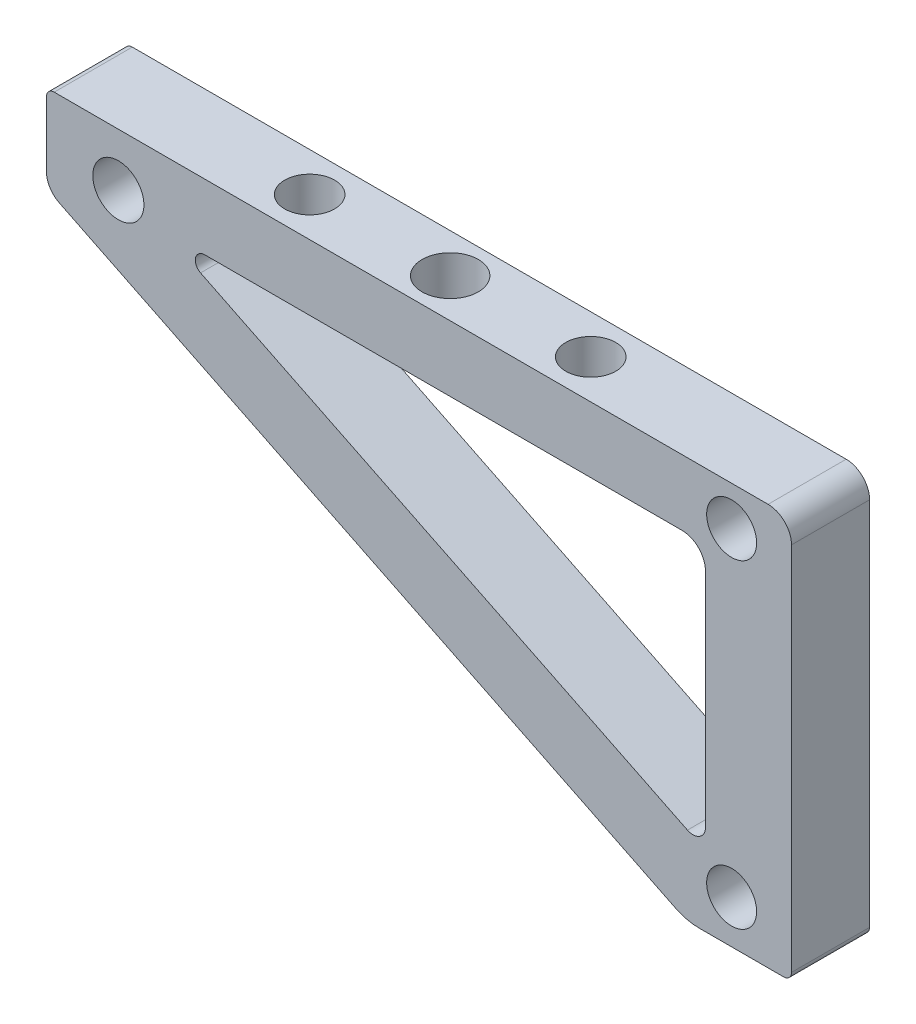
ISO-10303-21;
HEADER;
FILE_DESCRIPTION(('STEP AP214'),'2;1');
FILE_NAME('part.step','',(''),(''),'','','');
FILE_SCHEMA(('AUTOMOTIVE_DESIGN { 1 0 10303 214 1 1 1 1 }'));
ENDSEC;
DATA;
#1=APPLICATION_CONTEXT('core data for automotive mechanical design processes');
#2=APPLICATION_PROTOCOL_DEFINITION('international standard','automotive_design',2000,#1);
#3=PRODUCT_CONTEXT('',#1,'mechanical');
#4=PRODUCT('Part','Part','',(#3));
#5=PRODUCT_RELATED_PRODUCT_CATEGORY('part','',(#4));
#6=PRODUCT_DEFINITION_FORMATION('','',#4);
#7=PRODUCT_DEFINITION_CONTEXT('part definition',#1,'design');
#8=PRODUCT_DEFINITION('design','',#6,#7);
#9=PRODUCT_DEFINITION_SHAPE('','',#8);
#10=(LENGTH_UNIT() NAMED_UNIT(*) SI_UNIT(.MILLI.,.METRE.));
#11=(NAMED_UNIT(*) PLANE_ANGLE_UNIT() SI_UNIT($,.RADIAN.));
#12=(NAMED_UNIT(*) SI_UNIT($,.STERADIAN.) SOLID_ANGLE_UNIT());
#13=UNCERTAINTY_MEASURE_WITH_UNIT(LENGTH_MEASURE(1.E-05),#10,'distance_accuracy_value','');
#14=(GEOMETRIC_REPRESENTATION_CONTEXT(3) GLOBAL_UNCERTAINTY_ASSIGNED_CONTEXT((#13)) GLOBAL_UNIT_ASSIGNED_CONTEXT((#10,
#11,#12)) REPRESENTATION_CONTEXT('',''));
#15=CARTESIAN_POINT('',(0.,0.,0.));
#16=DIRECTION('',(0.,0.,1.));
#17=DIRECTION('',(1.,0.,0.));
#18=AXIS2_PLACEMENT_3D('',#15,#16,#17);
#19=CARTESIAN_POINT('',(13.3710113093788,-10.4732911103491,6.35));
#20=DIRECTION('',(0.,0.,1.));
#21=DIRECTION('',(1.,0.,0.));
#22=AXIS2_PLACEMENT_3D('',#19,#20,#21);
#23=PLANE('',#22);
#24=CARTESIAN_POINT('',(-33.8838438970048,13.4336716952027,6.35));
#25=DIRECTION('',(0.,0.,-1.));
#26=DIRECTION('',(-1.,0.,0.));
#27=AXIS2_PLACEMENT_3D('',#24,#25,#26);
#28=CIRCLE('',#27,2.07896372310807);
#29=CARTESIAN_POINT('',(-35.9628076201128,13.4336716952027,6.35));
#30=VERTEX_POINT('',#29);
#31=EDGE_CURVE('E552',#30,#30,#28,.T.);
#32=ORIENTED_EDGE('',*,*,#31,.T.);
#33=EDGE_LOOP('',(#32));
#34=FACE_BOUND('',#33,.T.);
#35=CARTESIAN_POINT('',(15.9873466903869,14.5382384856211,6.35));
#36=DIRECTION('',(0.,0.,-1.));
#37=DIRECTION('',(-1.,0.,0.));
#38=AXIS2_PLACEMENT_3D('',#35,#36,#37);
#39=CIRCLE('',#38,2.032);
#40=CARTESIAN_POINT('',(13.9553466903869,14.5382384856211,6.35));
#41=VERTEX_POINT('',#40);
#42=EDGE_CURVE('E556',#41,#41,#39,.T.);
#43=ORIENTED_EDGE('',*,*,#42,.T.);
#44=EDGE_LOOP('',(#43));
#45=FACE_BOUND('',#44,.T.);
#46=CARTESIAN_POINT('',(15.9873466903869,-11.4190810892118,6.35));
#47=DIRECTION('',(0.,0.,-1.));
#48=DIRECTION('',(-1.,0.,0.));
#49=AXIS2_PLACEMENT_3D('',#46,#47,#48);
#50=CIRCLE('',#49,2.032);
#51=CARTESIAN_POINT('',(13.9553466903869,-11.4190810892118,6.35));
#52=VERTEX_POINT('',#51);
#53=EDGE_CURVE('E566',#52,#52,#50,.T.);
#54=ORIENTED_EDGE('',*,*,#53,.T.);
#55=EDGE_LOOP('',(#54));
#56=FACE_BOUND('',#55,.T.);
#57=CARTESIAN_POINT('',(13.3710113093788,-10.4732911103491,6.35));
#58=DIRECTION('',(0.,0.,1.));
#59=DIRECTION('',(1.,0.,0.));
#60=AXIS2_PLACEMENT_3D('',#57,#58,#59);
#61=CIRCLE('',#60,4.44499999999991);
#62=CARTESIAN_POINT('',(11.4117177924005,-14.4631775641628,6.35));
#63=VERTEX_POINT('',#62);
#64=CARTESIAN_POINT('',(13.3710113093788,-14.918291110349,6.35));
#65=VERTEX_POINT('',#64);
#66=EDGE_CURVE('E210',#63,#65,#61,.T.);
#67=ORIENTED_EDGE('',*,*,#66,.T.);
#68=DIRECTION('',(1.,0.,0.));
#69=VECTOR('',#68,1.);
#70=CARTESIAN_POINT('',(13.3710113093788,-14.918291110349,6.35));
#71=LINE('',#70,#69);
#72=CARTESIAN_POINT('',(20.2217266524743,-14.918291110349,6.35));
#73=VERTEX_POINT('',#72);
#74=EDGE_CURVE('E209',#65,#73,#71,.T.);
#75=ORIENTED_EDGE('',*,*,#74,.T.);
#76=CARTESIAN_POINT('',(20.2217266524743,-14.283291110349,6.35));
#77=DIRECTION('',(0.,0.,1.));
#78=DIRECTION('',(1.,0.,0.));
#79=AXIS2_PLACEMENT_3D('',#76,#77,#78);
#80=CIRCLE('',#79,0.634999999999998);
#81=CARTESIAN_POINT('',(20.8567266524743,-14.283291110349,6.35));
#82=VERTEX_POINT('',#81);
#83=EDGE_CURVE('E213',#73,#82,#80,.T.);
#84=ORIENTED_EDGE('',*,*,#83,.T.);
#85=DIRECTION('',(0.,1.,0.));
#86=VECTOR('',#85,1.);
#87=CARTESIAN_POINT('',(20.8567266524743,15.8273321626688,6.35));
#88=LINE('',#87,#86);
#89=CARTESIAN_POINT('',(20.8567266524743,15.8273321626688,6.35));
#90=VERTEX_POINT('',#89);
#91=EDGE_CURVE('E214',#82,#90,#88,.T.);
#92=ORIENTED_EDGE('',*,*,#91,.T.);
#93=CARTESIAN_POINT('',(18.9517266524743,15.8273321626688,6.35));
#94=DIRECTION('',(0.,0.,1.));
#95=DIRECTION('',(1.,0.,0.));
#96=AXIS2_PLACEMENT_3D('',#93,#94,#95);
#97=CIRCLE('',#96,1.905);
#98=CARTESIAN_POINT('',(18.9517266524743,17.7323321626688,6.35));
#99=VERTEX_POINT('',#98);
#100=EDGE_CURVE('E220',#90,#99,#97,.T.);
#101=ORIENTED_EDGE('',*,*,#100,.T.);
#102=DIRECTION('',(-1.,0.,0.));
#103=VECTOR('',#102,1.);
#104=CARTESIAN_POINT('',(18.9517266524743,17.7323321626688,6.35));
#105=LINE('',#104,#103);
#106=CARTESIAN_POINT('',(-39.0992604233761,17.7323321626689,6.35));
#107=VERTEX_POINT('',#106);
#108=EDGE_CURVE('E218',#99,#107,#105,.T.);
#109=ORIENTED_EDGE('',*,*,#108,.T.);
#110=CARTESIAN_POINT('',(-39.0992604233761,17.0973321626688,6.35));
#111=DIRECTION('',(0.,0.,1.));
#112=DIRECTION('',(1.,0.,0.));
#113=AXIS2_PLACEMENT_3D('',#110,#111,#112);
#114=CIRCLE('',#113,0.635000000000011);
#115=CARTESIAN_POINT('',(-39.7342604233761,17.0973321626688,6.35));
#116=VERTEX_POINT('',#115);
#117=EDGE_CURVE('E222',#107,#116,#114,.T.);
#118=ORIENTED_EDGE('',*,*,#117,.T.);
#119=DIRECTION('',(0.,-1.,0.));
#120=VECTOR('',#119,1.);
#121=CARTESIAN_POINT('',(-39.7342604233761,17.0973321626688,6.35));
#122=LINE('',#121,#120);
#123=CARTESIAN_POINT('',(-39.7342604233761,11.839639722161,6.35));
#124=VERTEX_POINT('',#123);
#125=EDGE_CURVE('E224',#116,#124,#122,.T.);
#126=ORIENTED_EDGE('',*,*,#125,.T.);
#127=CARTESIAN_POINT('',(-37.8292604233761,11.839639722161,6.35));
#128=DIRECTION('',(0.,0.,1.));
#129=DIRECTION('',(1.,0.,0.));
#130=AXIS2_PLACEMENT_3D('',#127,#128,#129);
#131=CIRCLE('',#130,1.905);
#132=CARTESIAN_POINT('',(-38.6689576449382,10.1296883848123,6.35));
#133=VERTEX_POINT('',#132);
#134=EDGE_CURVE('E223',#124,#133,#131,.T.);
#135=ORIENTED_EDGE('',*,*,#134,.T.);
#136=DIRECTION('',(0.897612250576778,-0.44078594307724,0.));
#137=VECTOR('',#136,1.);
#138=CARTESIAN_POINT('',(-38.6689576449382,10.1296883848123,6.35));
#139=LINE('',#138,#137);
#140=EDGE_CURVE('E230',#133,#63,#139,.T.);
#141=ORIENTED_EDGE('',*,*,#140,.T.);
#142=EDGE_LOOP('',(#67,#75,#84,#92,#101,#109,#118,#126,#135,#141));
#143=FACE_BOUND('',#142,.T.);
#144=DIRECTION('',(0.897612250576778,-0.44078594307724,0.));
#145=VECTOR('',#144,1.);
#146=CARTESIAN_POINT('',(12.3946762268889,-8.49095327423301,6.35));
#147=LINE('',#146,#145);
#148=CARTESIAN_POINT('',(-27.199482674509,10.9523516277314,6.35));
#149=VERTEX_POINT('',#148);
#150=CARTESIAN_POINT('',(12.3946762268889,-8.49095327423301,6.35));
#151=VERTEX_POINT('',#150);
#152=EDGE_CURVE('E165',#149,#151,#147,.T.);
#153=ORIENTED_EDGE('',*,*,#152,.F.);
#154=CARTESIAN_POINT('',(-26.8636037858843,11.6363321626707,6.35));
#155=DIRECTION('',(0.,0.,1.));
#156=DIRECTION('',(-1.,0.,0.));
#157=AXIS2_PLACEMENT_3D('',#154,#155,#156);
#158=CIRCLE('',#157,0.761999999999749);
#159=CARTESIAN_POINT('',(-26.8636037858843,12.3983321626704,6.35));
#160=VERTEX_POINT('',#159);
#161=EDGE_CURVE('E152',#160,#149,#158,.T.);
#162=ORIENTED_EDGE('',*,*,#161,.F.);
#163=DIRECTION('',(-1.,0.,0.));
#164=VECTOR('',#163,1.);
#165=CARTESIAN_POINT('',(11.9535147450558,12.3983321626704,6.35));
#166=LINE('',#165,#164);
#167=CARTESIAN_POINT('',(11.9535147450558,12.3983321626704,6.35));
#168=VERTEX_POINT('',#167);
#169=EDGE_CURVE('E184',#168,#160,#166,.T.);
#170=ORIENTED_EDGE('',*,*,#169,.F.);
#171=CARTESIAN_POINT('',(11.9535147450558,10.4933321626704,6.35));
#172=DIRECTION('',(0.,0.,1.));
#173=DIRECTION('',(-1.,0.,0.));
#174=AXIS2_PLACEMENT_3D('',#171,#172,#173);
#175=CIRCLE('',#174,1.905);
#176=CARTESIAN_POINT('',(13.8585147450558,10.4933321626704,6.35));
#177=VERTEX_POINT('',#176);
#178=EDGE_CURVE('E185',#177,#168,#175,.T.);
#179=ORIENTED_EDGE('',*,*,#178,.F.);
#180=DIRECTION('',(0.,1.,0.));
#181=VECTOR('',#180,1.);
#182=CARTESIAN_POINT('',(13.8585147450558,-7.57897922764673,6.35));
#183=LINE('',#182,#181);
#184=CARTESIAN_POINT('',(13.8585147450557,-7.57897922764681,6.35));
#185=VERTEX_POINT('',#184);
#186=EDGE_CURVE('E180',#185,#177,#183,.T.);
#187=ORIENTED_EDGE('',*,*,#186,.F.);
#188=CARTESIAN_POINT('',(12.8425147450555,-7.57897922764681,6.35));
#189=DIRECTION('',(0.,0.,1.));
#190=DIRECTION('',(1.,0.,0.));
#191=AXIS2_PLACEMENT_3D('',#188,#189,#190);
#192=CIRCLE('',#191,1.01600000000027);
#193=EDGE_CURVE('E171',#151,#185,#192,.T.);
#194=ORIENTED_EDGE('',*,*,#193,.F.);
#195=EDGE_LOOP('',(#153,#162,#170,#179,#187,#194));
#196=FACE_BOUND('',#195,.T.);
#197=ADVANCED_FACE('F39',(#34,#45,#56,#143,#196),#23,.T.);
#198=CARTESIAN_POINT('',(13.3710113093788,-10.4732911103491,0.));
#199=DIRECTION('',(0.,0.,1.));
#200=DIRECTION('',(1.,0.,0.));
#201=AXIS2_PLACEMENT_3D('',#198,#199,#200);
#202=PLANE('',#201);
#203=CARTESIAN_POINT('',(-33.8838438970048,13.4336716952027,0.));
#204=DIRECTION('',(0.,0.,-1.));
#205=DIRECTION('',(-1.,0.,0.));
#206=AXIS2_PLACEMENT_3D('',#203,#204,#205);
#207=CIRCLE('',#206,2.07896372310807);
#208=CARTESIAN_POINT('',(-35.9628076201128,13.4336716952027,0.));
#209=VERTEX_POINT('',#208);
#210=EDGE_CURVE('E551',#209,#209,#207,.T.);
#211=ORIENTED_EDGE('',*,*,#210,.F.);
#212=EDGE_LOOP('',(#211));
#213=FACE_BOUND('',#212,.T.);
#214=CARTESIAN_POINT('',(15.9873466903869,14.5382384856211,0.));
#215=DIRECTION('',(0.,0.,-1.));
#216=DIRECTION('',(-1.,0.,0.));
#217=AXIS2_PLACEMENT_3D('',#214,#215,#216);
#218=CIRCLE('',#217,2.032);
#219=CARTESIAN_POINT('',(13.9553466903869,14.5382384856211,0.));
#220=VERTEX_POINT('',#219);
#221=EDGE_CURVE('E553',#220,#220,#218,.T.);
#222=ORIENTED_EDGE('',*,*,#221,.F.);
#223=EDGE_LOOP('',(#222));
#224=FACE_BOUND('',#223,.T.);
#225=CARTESIAN_POINT('',(15.9873466903869,-11.4190810892118,0.));
#226=DIRECTION('',(0.,0.,-1.));
#227=DIRECTION('',(-1.,0.,0.));
#228=AXIS2_PLACEMENT_3D('',#225,#226,#227);
#229=CIRCLE('',#228,2.032);
#230=CARTESIAN_POINT('',(13.9553466903869,-11.4190810892118,0.));
#231=VERTEX_POINT('',#230);
#232=EDGE_CURVE('E564',#231,#231,#229,.T.);
#233=ORIENTED_EDGE('',*,*,#232,.F.);
#234=EDGE_LOOP('',(#233));
#235=FACE_BOUND('',#234,.T.);
#236=CARTESIAN_POINT('',(13.3710113093788,-10.4732911103491,0.));
#237=DIRECTION('',(0.,0.,1.));
#238=DIRECTION('',(1.,0.,0.));
#239=AXIS2_PLACEMENT_3D('',#236,#237,#238);
#240=CIRCLE('',#239,4.44499999999991);
#241=CARTESIAN_POINT('',(11.4117177924005,-14.4631775641628,0.));
#242=VERTEX_POINT('',#241);
#243=CARTESIAN_POINT('',(13.3710113093788,-14.918291110349,0.));
#244=VERTEX_POINT('',#243);
#245=EDGE_CURVE('E168',#242,#244,#240,.T.);
#246=ORIENTED_EDGE('',*,*,#245,.F.);
#247=DIRECTION('',(0.897612250576778,-0.44078594307724,0.));
#248=VECTOR('',#247,1.);
#249=CARTESIAN_POINT('',(-38.6689576449382,10.1296883848123,0.));
#250=LINE('',#249,#248);
#251=CARTESIAN_POINT('',(-38.6689576449382,10.1296883848123,0.));
#252=VERTEX_POINT('',#251);
#253=EDGE_CURVE('E211',#252,#242,#250,.T.);
#254=ORIENTED_EDGE('',*,*,#253,.F.);
#255=CARTESIAN_POINT('',(-37.8292604233761,11.839639722161,0.));
#256=DIRECTION('',(0.,0.,1.));
#257=DIRECTION('',(1.,0.,0.));
#258=AXIS2_PLACEMENT_3D('',#255,#256,#257);
#259=CIRCLE('',#258,1.905);
#260=CARTESIAN_POINT('',(-39.7342604233761,11.839639722161,0.));
#261=VERTEX_POINT('',#260);
#262=EDGE_CURVE('E246',#261,#252,#259,.T.);
#263=ORIENTED_EDGE('',*,*,#262,.F.);
#264=DIRECTION('',(0.,-1.,0.));
#265=VECTOR('',#264,1.);
#266=CARTESIAN_POINT('',(-39.7342604233761,17.0973321626688,0.));
#267=LINE('',#266,#265);
#268=CARTESIAN_POINT('',(-39.7342604233761,17.0973321626688,0.));
#269=VERTEX_POINT('',#268);
#270=EDGE_CURVE('E244',#269,#261,#267,.T.);
#271=ORIENTED_EDGE('',*,*,#270,.F.);
#272=CARTESIAN_POINT('',(-39.0992604233761,17.0973321626688,0.));
#273=DIRECTION('',(0.,0.,1.));
#274=DIRECTION('',(1.,0.,0.));
#275=AXIS2_PLACEMENT_3D('',#272,#273,#274);
#276=CIRCLE('',#275,0.635000000000011);
#277=CARTESIAN_POINT('',(-39.0992604233761,17.7323321626689,0.));
#278=VERTEX_POINT('',#277);
#279=EDGE_CURVE('E245',#278,#269,#276,.T.);
#280=ORIENTED_EDGE('',*,*,#279,.F.);
#281=DIRECTION('',(-1.,0.,0.));
#282=VECTOR('',#281,1.);
#283=CARTESIAN_POINT('',(18.9517266524743,17.7323321626688,0.));
#284=LINE('',#283,#282);
#285=CARTESIAN_POINT('',(18.9517266524743,17.7323321626688,0.));
#286=VERTEX_POINT('',#285);
#287=EDGE_CURVE('E238',#286,#278,#284,.T.);
#288=ORIENTED_EDGE('',*,*,#287,.F.);
#289=CARTESIAN_POINT('',(18.9517266524743,15.8273321626688,0.));
#290=DIRECTION('',(0.,0.,1.));
#291=DIRECTION('',(1.,0.,0.));
#292=AXIS2_PLACEMENT_3D('',#289,#290,#291);
#293=CIRCLE('',#292,1.905);
#294=CARTESIAN_POINT('',(20.8567266524743,15.8273321626688,0.));
#295=VERTEX_POINT('',#294);
#296=EDGE_CURVE('E236',#295,#286,#293,.T.);
#297=ORIENTED_EDGE('',*,*,#296,.F.);
#298=DIRECTION('',(0.,1.,0.));
#299=VECTOR('',#298,1.);
#300=CARTESIAN_POINT('',(20.8567266524743,15.8273321626688,0.));
#301=LINE('',#300,#299);
#302=CARTESIAN_POINT('',(20.8567266524743,-14.283291110349,0.));
#303=VERTEX_POINT('',#302);
#304=EDGE_CURVE('E237',#303,#295,#301,.T.);
#305=ORIENTED_EDGE('',*,*,#304,.F.);
#306=CARTESIAN_POINT('',(20.2217266524743,-14.283291110349,0.));
#307=DIRECTION('',(0.,0.,1.));
#308=DIRECTION('',(1.,0.,0.));
#309=AXIS2_PLACEMENT_3D('',#306,#307,#308);
#310=CIRCLE('',#309,0.634999999999998);
#311=CARTESIAN_POINT('',(20.2217266524743,-14.918291110349,0.));
#312=VERTEX_POINT('',#311);
#313=EDGE_CURVE('E232',#312,#303,#310,.T.);
#314=ORIENTED_EDGE('',*,*,#313,.F.);
#315=DIRECTION('',(1.,0.,0.));
#316=VECTOR('',#315,1.);
#317=CARTESIAN_POINT('',(13.3710113093788,-14.918291110349,0.));
#318=LINE('',#317,#316);
#319=EDGE_CURVE('E235',#244,#312,#318,.T.);
#320=ORIENTED_EDGE('',*,*,#319,.F.);
#321=EDGE_LOOP('',(#246,#254,#263,#271,#280,#288,#297,#305,#314,#320));
#322=FACE_BOUND('',#321,.T.);
#323=CARTESIAN_POINT('',(-26.8636037858843,11.6363321626707,0.));
#324=DIRECTION('',(0.,0.,1.));
#325=DIRECTION('',(-1.,0.,0.));
#326=AXIS2_PLACEMENT_3D('',#323,#324,#325);
#327=CIRCLE('',#326,0.761999999999749);
#328=CARTESIAN_POINT('',(-26.8636037858843,12.3983321626704,0.));
#329=VERTEX_POINT('',#328);
#330=CARTESIAN_POINT('',(-27.199482674509,10.9523516277314,0.));
#331=VERTEX_POINT('',#330);
#332=EDGE_CURVE('E64',#329,#331,#327,.T.);
#333=ORIENTED_EDGE('',*,*,#332,.T.);
#334=DIRECTION('',(0.897612250576778,-0.44078594307724,0.));
#335=VECTOR('',#334,1.);
#336=CARTESIAN_POINT('',(12.3946762268889,-8.49095327423301,0.));
#337=LINE('',#336,#335);
#338=CARTESIAN_POINT('',(12.3946762268889,-8.49095327423301,0.));
#339=VERTEX_POINT('',#338);
#340=EDGE_CURVE('E166',#331,#339,#337,.T.);
#341=ORIENTED_EDGE('',*,*,#340,.T.);
#342=CARTESIAN_POINT('',(12.8425147450555,-7.57897922764681,0.));
#343=DIRECTION('',(0.,0.,1.));
#344=DIRECTION('',(1.,0.,0.));
#345=AXIS2_PLACEMENT_3D('',#342,#343,#344);
#346=CIRCLE('',#345,1.01600000000027);
#347=CARTESIAN_POINT('',(13.8585147450557,-7.57897922764681,0.));
#348=VERTEX_POINT('',#347);
#349=EDGE_CURVE('E189',#339,#348,#346,.T.);
#350=ORIENTED_EDGE('',*,*,#349,.T.);
#351=DIRECTION('',(0.,1.,0.));
#352=VECTOR('',#351,1.);
#353=CARTESIAN_POINT('',(13.8585147450558,-7.57897922764673,0.));
#354=LINE('',#353,#352);
#355=CARTESIAN_POINT('',(13.8585147450558,10.4933321626704,0.));
#356=VERTEX_POINT('',#355);
#357=EDGE_CURVE('E195',#348,#356,#354,.T.);
#358=ORIENTED_EDGE('',*,*,#357,.T.);
#359=CARTESIAN_POINT('',(11.9535147450558,10.4933321626704,0.));
#360=DIRECTION('',(0.,0.,1.));
#361=DIRECTION('',(-1.,0.,0.));
#362=AXIS2_PLACEMENT_3D('',#359,#360,#361);
#363=CIRCLE('',#362,1.905);
#364=CARTESIAN_POINT('',(11.9535147450558,12.3983321626704,0.));
#365=VERTEX_POINT('',#364);
#366=EDGE_CURVE('E194',#356,#365,#363,.T.);
#367=ORIENTED_EDGE('',*,*,#366,.T.);
#368=DIRECTION('',(-1.,0.,0.));
#369=VECTOR('',#368,1.);
#370=CARTESIAN_POINT('',(11.9535147450558,12.3983321626704,0.));
#371=LINE('',#370,#369);
#372=EDGE_CURVE('E162',#365,#329,#371,.T.);
#373=ORIENTED_EDGE('',*,*,#372,.T.);
#374=EDGE_LOOP('',(#333,#341,#350,#358,#367,#373));
#375=FACE_BOUND('',#374,.T.);
#376=ADVANCED_FACE('F291',(#213,#224,#235,#322,#375),#202,.F.);
#377=CARTESIAN_POINT('',(13.3710113093788,-10.4732911103491,6.35));
#378=DIRECTION('',(0.,0.,-1.));
#379=DIRECTION('',(-1.,0.,0.));
#380=AXIS2_PLACEMENT_3D('',#377,#378,#379);
#381=CYLINDRICAL_SURFACE('',#380,4.44499999999991);
#382=ORIENTED_EDGE('',*,*,#245,.T.);
#383=DIRECTION('',(0.,0.,-1.));
#384=VECTOR('',#383,1.);
#385=CARTESIAN_POINT('',(13.3710113093788,-14.918291110349,6.35));
#386=LINE('',#385,#384);
#387=EDGE_CURVE('E11',#65,#244,#386,.T.);
#388=ORIENTED_EDGE('',*,*,#387,.F.);
#389=ORIENTED_EDGE('',*,*,#66,.F.);
#390=DIRECTION('',(0.,0.,-1.));
#391=VECTOR('',#390,1.);
#392=CARTESIAN_POINT('',(11.4117177924005,-14.4631775641628,6.35));
#393=LINE('',#392,#391);
#394=EDGE_CURVE('E229',#63,#242,#393,.T.);
#395=ORIENTED_EDGE('',*,*,#394,.T.);
#396=EDGE_LOOP('',(#382,#388,#389,#395));
#397=FACE_BOUND('',#396,.T.);
#398=ADVANCED_FACE('F41',(#397),#381,.T.);
#399=CARTESIAN_POINT('',(13.3710113093788,-14.918291110349,6.35));
#400=DIRECTION('',(0.,1.,0.));
#401=DIRECTION('',(0.,0.,1.));
#402=AXIS2_PLACEMENT_3D('',#399,#400,#401);
#403=PLANE('',#402);
#404=ORIENTED_EDGE('',*,*,#319,.T.);
#405=DIRECTION('',(0.,0.,-1.));
#406=VECTOR('',#405,1.);
#407=CARTESIAN_POINT('',(20.2217266524743,-14.918291110349,6.35));
#408=LINE('',#407,#406);
#409=EDGE_CURVE('E48',#73,#312,#408,.T.);
#410=ORIENTED_EDGE('',*,*,#409,.F.);
#411=ORIENTED_EDGE('',*,*,#74,.F.);
#412=ORIENTED_EDGE('',*,*,#387,.T.);
#413=EDGE_LOOP('',(#404,#410,#411,#412));
#414=FACE_BOUND('',#413,.T.);
#415=ADVANCED_FACE('F351',(#414),#403,.F.);
#416=CARTESIAN_POINT('',(20.2217266524743,-14.283291110349,6.35));
#417=DIRECTION('',(0.,0.,-1.));
#418=DIRECTION('',(-1.,0.,0.));
#419=AXIS2_PLACEMENT_3D('',#416,#417,#418);
#420=CYLINDRICAL_SURFACE('',#419,0.634999999999998);
#421=ORIENTED_EDGE('',*,*,#313,.T.);
#422=DIRECTION('',(0.,0.,-1.));
#423=VECTOR('',#422,1.);
#424=CARTESIAN_POINT('',(20.8567266524743,-14.283291110349,6.35));
#425=LINE('',#424,#423);
#426=EDGE_CURVE('E267',#82,#303,#425,.T.);
#427=ORIENTED_EDGE('',*,*,#426,.F.);
#428=ORIENTED_EDGE('',*,*,#83,.F.);
#429=ORIENTED_EDGE('',*,*,#409,.T.);
#430=EDGE_LOOP('',(#421,#427,#428,#429));
#431=FACE_BOUND('',#430,.T.);
#432=ADVANCED_FACE('F355',(#431),#420,.T.);
#433=CARTESIAN_POINT('',(20.8567266524743,15.8273321626688,6.35));
#434=DIRECTION('',(-1.,0.,0.));
#435=DIRECTION('',(0.,-1.,0.));
#436=AXIS2_PLACEMENT_3D('',#433,#434,#435);
#437=PLANE('',#436);
#438=ORIENTED_EDGE('',*,*,#304,.T.);
#439=DIRECTION('',(0.,0.,-1.));
#440=VECTOR('',#439,1.);
#441=CARTESIAN_POINT('',(20.8567266524743,15.8273321626688,6.35));
#442=LINE('',#441,#440);
#443=EDGE_CURVE('E266',#90,#295,#442,.T.);
#444=ORIENTED_EDGE('',*,*,#443,.F.);
#445=ORIENTED_EDGE('',*,*,#91,.F.);
#446=ORIENTED_EDGE('',*,*,#426,.T.);
#447=EDGE_LOOP('',(#438,#444,#445,#446));
#448=FACE_BOUND('',#447,.T.);
#449=ADVANCED_FACE('F346',(#448),#437,.F.);
#450=CARTESIAN_POINT('',(18.9517266524743,15.8273321626688,6.35));
#451=DIRECTION('',(0.,0.,-1.));
#452=DIRECTION('',(-1.,0.,0.));
#453=AXIS2_PLACEMENT_3D('',#450,#451,#452);
#454=CYLINDRICAL_SURFACE('',#453,1.905);
#455=ORIENTED_EDGE('',*,*,#296,.T.);
#456=DIRECTION('',(0.,0.,-1.));
#457=VECTOR('',#456,1.);
#458=CARTESIAN_POINT('',(18.9517266524743,17.7323321626688,6.35));
#459=LINE('',#458,#457);
#460=EDGE_CURVE('E263',#99,#286,#459,.T.);
#461=ORIENTED_EDGE('',*,*,#460,.F.);
#462=ORIENTED_EDGE('',*,*,#100,.F.);
#463=ORIENTED_EDGE('',*,*,#443,.T.);
#464=EDGE_LOOP('',(#455,#461,#462,#463));
#465=FACE_BOUND('',#464,.T.);
#466=ADVANCED_FACE('F342',(#465),#454,.T.);
#467=CARTESIAN_POINT('',(18.9517266524743,17.7323321626688,6.35));
#468=DIRECTION('',(0.,-1.,0.));
#469=DIRECTION('',(0.,0.,-1.));
#470=AXIS2_PLACEMENT_3D('',#467,#468,#469);
#471=PLANE('',#470);
#472=CARTESIAN_POINT('',(-10.0737668854509,17.7323321626688,3.17500000000001));
#473=DIRECTION('',(0.,1.,0.));
#474=DIRECTION('',(-1.,0.,0.));
#475=AXIS2_PLACEMENT_3D('',#472,#473,#474);
#476=CIRCLE('',#475,2.286);
#477=CARTESIAN_POINT('',(-12.3597668854509,17.7323321626688,3.17500000000001));
#478=VERTEX_POINT('',#477);
#479=EDGE_CURVE('E560',#478,#478,#476,.T.);
#480=ORIENTED_EDGE('',*,*,#479,.F.);
#481=EDGE_LOOP('',(#480));
#482=FACE_BOUND('',#481,.T.);
#483=CARTESIAN_POINT('',(-21.5037668854509,17.7323321626688,3.175));
#484=DIRECTION('',(0.,1.,0.));
#485=DIRECTION('',(-1.,0.,0.));
#486=AXIS2_PLACEMENT_3D('',#483,#484,#485);
#487=CIRCLE('',#486,2.032);
#488=CARTESIAN_POINT('',(-23.5357668854509,17.7323321626688,3.175));
#489=VERTEX_POINT('',#488);
#490=EDGE_CURVE('E277',#489,#489,#487,.T.);
#491=ORIENTED_EDGE('',*,*,#490,.F.);
#492=EDGE_LOOP('',(#491));
#493=FACE_BOUND('',#492,.T.);
#494=CARTESIAN_POINT('',(1.35623311454914,17.7323321626688,3.175));
#495=DIRECTION('',(0.,1.,0.));
#496=DIRECTION('',(1.,0.,0.));
#497=AXIS2_PLACEMENT_3D('',#494,#495,#496);
#498=CIRCLE('',#497,2.032);
#499=CARTESIAN_POINT('',(3.38823311454914,17.7323321626688,3.175));
#500=VERTEX_POINT('',#499);
#501=EDGE_CURVE('E574',#500,#500,#498,.T.);
#502=ORIENTED_EDGE('',*,*,#501,.F.);
#503=EDGE_LOOP('',(#502));
#504=FACE_BOUND('',#503,.T.);
#505=ORIENTED_EDGE('',*,*,#287,.T.);
#506=DIRECTION('',(0.,0.,-1.));
#507=VECTOR('',#506,1.);
#508=CARTESIAN_POINT('',(-39.0992604233761,17.7323321626689,6.35));
#509=LINE('',#508,#507);
#510=EDGE_CURVE('E257',#107,#278,#509,.T.);
#511=ORIENTED_EDGE('',*,*,#510,.F.);
#512=ORIENTED_EDGE('',*,*,#108,.F.);
#513=ORIENTED_EDGE('',*,*,#460,.T.);
#514=EDGE_LOOP('',(#505,#511,#512,#513));
#515=FACE_BOUND('',#514,.T.);
#516=ADVANCED_FACE('F336',(#482,#493,#504,#515),#471,.F.);
#517=CARTESIAN_POINT('',(-39.0992604233761,17.0973321626688,6.35));
#518=DIRECTION('',(0.,0.,-1.));
#519=DIRECTION('',(-1.,0.,0.));
#520=AXIS2_PLACEMENT_3D('',#517,#518,#519);
#521=CYLINDRICAL_SURFACE('',#520,0.635000000000011);
#522=ORIENTED_EDGE('',*,*,#279,.T.);
#523=DIRECTION('',(0.,0.,-1.));
#524=VECTOR('',#523,1.);
#525=CARTESIAN_POINT('',(-39.7342604233761,17.0973321626688,6.35));
#526=LINE('',#525,#524);
#527=EDGE_CURVE('E260',#116,#269,#526,.T.);
#528=ORIENTED_EDGE('',*,*,#527,.F.);
#529=ORIENTED_EDGE('',*,*,#117,.F.);
#530=ORIENTED_EDGE('',*,*,#510,.T.);
#531=EDGE_LOOP('',(#522,#528,#529,#530));
#532=FACE_BOUND('',#531,.T.);
#533=ADVANCED_FACE('F337',(#532),#521,.T.);
#534=CARTESIAN_POINT('',(-39.7342604233761,17.0973321626688,6.35));
#535=DIRECTION('',(1.,0.,0.));
#536=DIRECTION('',(0.,1.,0.));
#537=AXIS2_PLACEMENT_3D('',#534,#535,#536);
#538=PLANE('',#537);
#539=ORIENTED_EDGE('',*,*,#270,.T.);
#540=DIRECTION('',(0.,0.,-1.));
#541=VECTOR('',#540,1.);
#542=CARTESIAN_POINT('',(-39.7342604233761,11.839639722161,6.35));
#543=LINE('',#542,#541);
#544=EDGE_CURVE('E255',#124,#261,#543,.T.);
#545=ORIENTED_EDGE('',*,*,#544,.F.);
#546=ORIENTED_EDGE('',*,*,#125,.F.);
#547=ORIENTED_EDGE('',*,*,#527,.T.);
#548=EDGE_LOOP('',(#539,#545,#546,#547));
#549=FACE_BOUND('',#548,.T.);
#550=ADVANCED_FACE('F335',(#549),#538,.F.);
#551=CARTESIAN_POINT('',(-37.8292604233761,11.839639722161,6.35));
#552=DIRECTION('',(0.,0.,-1.));
#553=DIRECTION('',(-1.,0.,0.));
#554=AXIS2_PLACEMENT_3D('',#551,#552,#553);
#555=CYLINDRICAL_SURFACE('',#554,1.905);
#556=ORIENTED_EDGE('',*,*,#262,.T.);
#557=DIRECTION('',(0.,0.,-1.));
#558=VECTOR('',#557,1.);
#559=CARTESIAN_POINT('',(-38.6689576449382,10.1296883848123,6.35));
#560=LINE('',#559,#558);
#561=EDGE_CURVE('E253',#133,#252,#560,.T.);
#562=ORIENTED_EDGE('',*,*,#561,.F.);
#563=ORIENTED_EDGE('',*,*,#134,.F.);
#564=ORIENTED_EDGE('',*,*,#544,.T.);
#565=EDGE_LOOP('',(#556,#562,#563,#564));
#566=FACE_BOUND('',#565,.T.);
#567=ADVANCED_FACE('F327',(#566),#555,.T.);
#568=CARTESIAN_POINT('',(-38.6689576449382,10.1296883848123,6.35));
#569=DIRECTION('',(0.44078594307724,0.897612250576778,0.));
#570=DIRECTION('',(-0.897612250576778,0.44078594307724,0.));
#571=AXIS2_PLACEMENT_3D('',#568,#569,#570);
#572=PLANE('',#571);
#573=ORIENTED_EDGE('',*,*,#253,.T.);
#574=ORIENTED_EDGE('',*,*,#394,.F.);
#575=ORIENTED_EDGE('',*,*,#140,.F.);
#576=ORIENTED_EDGE('',*,*,#561,.T.);
#577=EDGE_LOOP('',(#573,#574,#575,#576));
#578=FACE_BOUND('',#577,.T.);
#579=ADVANCED_FACE('F324',(#578),#572,.F.);
#580=CARTESIAN_POINT('',(-26.8636037858843,11.6363321626707,6.35));
#581=DIRECTION('',(0.,0.,-1.));
#582=DIRECTION('',(-1.,0.,0.));
#583=AXIS2_PLACEMENT_3D('',#580,#581,#582);
#584=CYLINDRICAL_SURFACE('',#583,0.761999999999749);
#585=ORIENTED_EDGE('',*,*,#332,.F.);
#586=DIRECTION('',(0.,0.,-1.));
#587=VECTOR('',#586,1.);
#588=CARTESIAN_POINT('',(-26.8636037858843,12.3983321626704,6.35));
#589=LINE('',#588,#587);
#590=EDGE_CURVE('E158',#160,#329,#589,.T.);
#591=ORIENTED_EDGE('',*,*,#590,.F.);
#592=ORIENTED_EDGE('',*,*,#161,.T.);
#593=DIRECTION('',(0.,0.,-1.));
#594=VECTOR('',#593,1.);
#595=CARTESIAN_POINT('',(-27.199482674509,10.9523516277314,6.35));
#596=LINE('',#595,#594);
#597=EDGE_CURVE('E160',#149,#331,#596,.T.);
#598=ORIENTED_EDGE('',*,*,#597,.T.);
#599=EDGE_LOOP('',(#585,#591,#592,#598));
#600=FACE_BOUND('',#599,.T.);
#601=ADVANCED_FACE('F156',(#600),#584,.F.);
#602=CARTESIAN_POINT('',(12.3946762268889,-8.49095327423301,6.35));
#603=DIRECTION('',(0.44078594307724,0.897612250576778,0.));
#604=DIRECTION('',(-0.897612250576778,0.44078594307724,0.));
#605=AXIS2_PLACEMENT_3D('',#602,#603,#604);
#606=PLANE('',#605);
#607=ORIENTED_EDGE('',*,*,#340,.F.);
#608=ORIENTED_EDGE('',*,*,#597,.F.);
#609=ORIENTED_EDGE('',*,*,#152,.T.);
#610=DIRECTION('',(0.,0.,-1.));
#611=VECTOR('',#610,1.);
#612=CARTESIAN_POINT('',(12.3946762268889,-8.49095327423301,6.35));
#613=LINE('',#612,#611);
#614=EDGE_CURVE('E172',#151,#339,#613,.T.);
#615=ORIENTED_EDGE('',*,*,#614,.T.);
#616=EDGE_LOOP('',(#607,#608,#609,#615));
#617=FACE_BOUND('',#616,.T.);
#618=ADVANCED_FACE('F167',(#617),#606,.T.);
#619=CARTESIAN_POINT('',(12.8425147450555,-7.57897922764681,6.35));
#620=DIRECTION('',(0.,0.,-1.));
#621=DIRECTION('',(-1.,0.,0.));
#622=AXIS2_PLACEMENT_3D('',#619,#620,#621);
#623=CYLINDRICAL_SURFACE('',#622,1.01600000000027);
#624=ORIENTED_EDGE('',*,*,#349,.F.);
#625=ORIENTED_EDGE('',*,*,#614,.F.);
#626=ORIENTED_EDGE('',*,*,#193,.T.);
#627=DIRECTION('',(0.,0.,-1.));
#628=VECTOR('',#627,1.);
#629=CARTESIAN_POINT('',(13.8585147450557,-7.57897922764681,6.35));
#630=LINE('',#629,#628);
#631=EDGE_CURVE('E204',#185,#348,#630,.T.);
#632=ORIENTED_EDGE('',*,*,#631,.T.);
#633=EDGE_LOOP('',(#624,#625,#626,#632));
#634=FACE_BOUND('',#633,.T.);
#635=ADVANCED_FACE('F303',(#634),#623,.F.);
#636=CARTESIAN_POINT('',(13.8585147450558,-7.57897922764673,6.35));
#637=DIRECTION('',(-1.,0.,0.));
#638=DIRECTION('',(0.,-1.,0.));
#639=AXIS2_PLACEMENT_3D('',#636,#637,#638);
#640=PLANE('',#639);
#641=ORIENTED_EDGE('',*,*,#357,.F.);
#642=ORIENTED_EDGE('',*,*,#631,.F.);
#643=ORIENTED_EDGE('',*,*,#186,.T.);
#644=DIRECTION('',(0.,0.,-1.));
#645=VECTOR('',#644,1.);
#646=CARTESIAN_POINT('',(13.8585147450558,10.4933321626704,6.35));
#647=LINE('',#646,#645);
#648=EDGE_CURVE('E205',#177,#356,#647,.T.);
#649=ORIENTED_EDGE('',*,*,#648,.T.);
#650=EDGE_LOOP('',(#641,#642,#643,#649));
#651=FACE_BOUND('',#650,.T.);
#652=ADVANCED_FACE('F296',(#651),#640,.T.);
#653=CARTESIAN_POINT('',(11.9535147450558,10.4933321626704,6.35));
#654=DIRECTION('',(0.,0.,-1.));
#655=DIRECTION('',(-1.,0.,0.));
#656=AXIS2_PLACEMENT_3D('',#653,#654,#655);
#657=CYLINDRICAL_SURFACE('',#656,1.905);
#658=ORIENTED_EDGE('',*,*,#366,.F.);
#659=ORIENTED_EDGE('',*,*,#648,.F.);
#660=ORIENTED_EDGE('',*,*,#178,.T.);
#661=DIRECTION('',(0.,0.,-1.));
#662=VECTOR('',#661,1.);
#663=CARTESIAN_POINT('',(11.9535147450558,12.3983321626704,6.35));
#664=LINE('',#663,#662);
#665=EDGE_CURVE('E57',#168,#365,#664,.T.);
#666=ORIENTED_EDGE('',*,*,#665,.T.);
#667=EDGE_LOOP('',(#658,#659,#660,#666));
#668=FACE_BOUND('',#667,.T.);
#669=ADVANCED_FACE('F290',(#668),#657,.F.);
#670=CARTESIAN_POINT('',(11.9535147450558,12.3983321626704,6.35));
#671=DIRECTION('',(0.,-1.,0.));
#672=DIRECTION('',(1.,0.,0.));
#673=AXIS2_PLACEMENT_3D('',#670,#671,#672);
#674=PLANE('',#673);
#675=CARTESIAN_POINT('',(-10.0737668854509,12.3983321626704,3.17500000000001));
#676=DIRECTION('',(0.,-1.,0.));
#677=DIRECTION('',(1.,0.,0.));
#678=AXIS2_PLACEMENT_3D('',#675,#676,#677);
#679=CIRCLE('',#678,2.286);
#680=CARTESIAN_POINT('',(-7.78776688545086,12.3983321626704,3.17500000000001));
#681=VERTEX_POINT('',#680);
#682=EDGE_CURVE('E43',#681,#681,#679,.T.);
#683=ORIENTED_EDGE('',*,*,#682,.F.);
#684=EDGE_LOOP('',(#683));
#685=FACE_BOUND('',#684,.T.);
#686=CARTESIAN_POINT('',(-21.5037668854509,12.3983321626704,3.175));
#687=DIRECTION('',(0.,-1.,0.));
#688=DIRECTION('',(1.,0.,0.));
#689=AXIS2_PLACEMENT_3D('',#686,#687,#688);
#690=CIRCLE('',#689,2.032);
#691=CARTESIAN_POINT('',(-19.4717668854509,12.3983321626704,3.175));
#692=VERTEX_POINT('',#691);
#693=EDGE_CURVE('E190',#692,#692,#690,.T.);
#694=ORIENTED_EDGE('',*,*,#693,.F.);
#695=EDGE_LOOP('',(#694));
#696=FACE_BOUND('',#695,.T.);
#697=CARTESIAN_POINT('',(1.35623311454914,12.3983321626704,3.175));
#698=DIRECTION('',(0.,-1.,0.));
#699=DIRECTION('',(1.,0.,0.));
#700=AXIS2_PLACEMENT_3D('',#697,#698,#699);
#701=CIRCLE('',#700,2.032);
#702=CARTESIAN_POINT('',(3.38823311454914,12.3983321626704,3.175));
#703=VERTEX_POINT('',#702);
#704=EDGE_CURVE('E273',#703,#703,#701,.T.);
#705=ORIENTED_EDGE('',*,*,#704,.F.);
#706=EDGE_LOOP('',(#705));
#707=FACE_BOUND('',#706,.T.);
#708=ORIENTED_EDGE('',*,*,#372,.F.);
#709=ORIENTED_EDGE('',*,*,#665,.F.);
#710=ORIENTED_EDGE('',*,*,#169,.T.);
#711=ORIENTED_EDGE('',*,*,#590,.T.);
#712=EDGE_LOOP('',(#708,#709,#710,#711));
#713=FACE_BOUND('',#712,.T.);
#714=ADVANCED_FACE('F283',(#685,#696,#707,#713),#674,.T.);
#715=CARTESIAN_POINT('',(1.35623311454914,10.8743321626688,3.175));
#716=DIRECTION('',(0.,1.,0.));
#717=DIRECTION('',(-1.,0.,0.));
#718=AXIS2_PLACEMENT_3D('',#715,#716,#717);
#719=CYLINDRICAL_SURFACE('',#718,2.032);
#720=ORIENTED_EDGE('',*,*,#704,.T.);
#721=EDGE_LOOP('',(#720));
#722=FACE_BOUND('',#721,.T.);
#723=ORIENTED_EDGE('',*,*,#501,.T.);
#724=EDGE_LOOP('',(#723));
#725=FACE_BOUND('',#724,.T.);
#726=ADVANCED_FACE('F286',(#722,#725),#719,.F.);
#727=CARTESIAN_POINT('',(-21.5037668854509,10.8743321626688,3.175));
#728=DIRECTION('',(0.,1.,0.));
#729=DIRECTION('',(-1.,0.,0.));
#730=AXIS2_PLACEMENT_3D('',#727,#728,#729);
#731=CYLINDRICAL_SURFACE('',#730,2.032);
#732=ORIENTED_EDGE('',*,*,#693,.T.);
#733=EDGE_LOOP('',(#732));
#734=FACE_BOUND('',#733,.T.);
#735=ORIENTED_EDGE('',*,*,#490,.T.);
#736=EDGE_LOOP('',(#735));
#737=FACE_BOUND('',#736,.T.);
#738=ADVANCED_FACE('F278',(#734,#737),#731,.F.);
#739=CARTESIAN_POINT('',(-10.0737668854509,10.8743321626688,3.17500000000001));
#740=DIRECTION('',(0.,1.,0.));
#741=DIRECTION('',(-1.,0.,0.));
#742=AXIS2_PLACEMENT_3D('',#739,#740,#741);
#743=CYLINDRICAL_SURFACE('',#742,2.286);
#744=ORIENTED_EDGE('',*,*,#682,.T.);
#745=EDGE_LOOP('',(#744));
#746=FACE_BOUND('',#745,.T.);
#747=ORIENTED_EDGE('',*,*,#479,.T.);
#748=EDGE_LOOP('',(#747));
#749=FACE_BOUND('',#748,.T.);
#750=ADVANCED_FACE('F508',(#746,#749),#743,.F.);
#751=CARTESIAN_POINT('',(15.9873466903869,-11.4190810892118,6.35));
#752=DIRECTION('',(0.,0.,-1.));
#753=DIRECTION('',(-1.,0.,0.));
#754=AXIS2_PLACEMENT_3D('',#751,#752,#753);
#755=CYLINDRICAL_SURFACE('',#754,2.032);
#756=ORIENTED_EDGE('',*,*,#53,.F.);
#757=EDGE_LOOP('',(#756));
#758=FACE_BOUND('',#757,.T.);
#759=ORIENTED_EDGE('',*,*,#232,.T.);
#760=EDGE_LOOP('',(#759));
#761=FACE_BOUND('',#760,.T.);
#762=ADVANCED_FACE('F517',(#758,#761),#755,.F.);
#763=CARTESIAN_POINT('',(15.9873466903869,14.5382384856211,6.35));
#764=DIRECTION('',(0.,0.,-1.));
#765=DIRECTION('',(-1.,0.,0.));
#766=AXIS2_PLACEMENT_3D('',#763,#764,#765);
#767=CYLINDRICAL_SURFACE('',#766,2.032);
#768=ORIENTED_EDGE('',*,*,#42,.F.);
#769=EDGE_LOOP('',(#768));
#770=FACE_BOUND('',#769,.T.);
#771=ORIENTED_EDGE('',*,*,#221,.T.);
#772=EDGE_LOOP('',(#771));
#773=FACE_BOUND('',#772,.T.);
#774=ADVANCED_FACE('F528',(#770,#773),#767,.F.);
#775=CARTESIAN_POINT('',(-33.8838438970048,13.4336716952027,6.35));
#776=DIRECTION('',(0.,0.,-1.));
#777=DIRECTION('',(-1.,0.,0.));
#778=AXIS2_PLACEMENT_3D('',#775,#776,#777);
#779=CYLINDRICAL_SURFACE('',#778,2.07896372310807);
#780=ORIENTED_EDGE('',*,*,#31,.F.);
#781=EDGE_LOOP('',(#780));
#782=FACE_BOUND('',#781,.T.);
#783=ORIENTED_EDGE('',*,*,#210,.T.);
#784=EDGE_LOOP('',(#783));
#785=FACE_BOUND('',#784,.T.);
#786=ADVANCED_FACE('F536',(#782,#785),#779,.F.);
#787=CLOSED_SHELL('',(#197,#376,#398,#415,#432,#449,#466,#516,#533,#550,#567,#579,#601,#618,
#635,#652,#669,#714,#726,#738,#750,#762,#774,#786));
#788=MANIFOLD_SOLID_BREP('B2',#787);
#789=ADVANCED_BREP_SHAPE_REPRESENTATION('',(#18,#788),#14);
#790=SHAPE_DEFINITION_REPRESENTATION(#9,#789);
ENDSEC;
END-ISO-10303-21;
